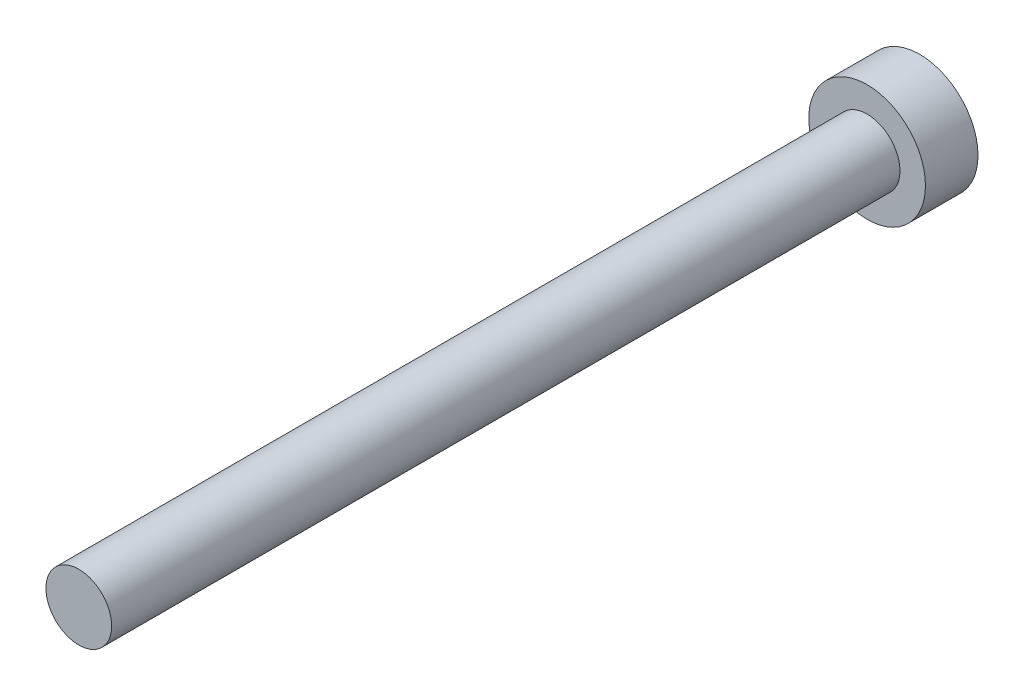
ISO-10303-21;
HEADER;
FILE_DESCRIPTION(('STEP AP214'),'2;1');
FILE_NAME('part.step','',(''),(''),'','','');
FILE_SCHEMA(('AUTOMOTIVE_DESIGN { 1 0 10303 214 1 1 1 1 }'));
ENDSEC;
DATA;
#1=APPLICATION_CONTEXT('core data for automotive mechanical design processes');
#2=APPLICATION_PROTOCOL_DEFINITION('international standard','automotive_design',2000,#1);
#3=PRODUCT_CONTEXT('',#1,'mechanical');
#4=PRODUCT('Part','Part','',(#3));
#5=PRODUCT_RELATED_PRODUCT_CATEGORY('part','',(#4));
#6=PRODUCT_DEFINITION_FORMATION('','',#4);
#7=PRODUCT_DEFINITION_CONTEXT('part definition',#1,'design');
#8=PRODUCT_DEFINITION('design','',#6,#7);
#9=PRODUCT_DEFINITION_SHAPE('','',#8);
#10=(LENGTH_UNIT() NAMED_UNIT(*) SI_UNIT(.MILLI.,.METRE.));
#11=(NAMED_UNIT(*) PLANE_ANGLE_UNIT() SI_UNIT($,.RADIAN.));
#12=(NAMED_UNIT(*) SI_UNIT($,.STERADIAN.) SOLID_ANGLE_UNIT());
#13=UNCERTAINTY_MEASURE_WITH_UNIT(LENGTH_MEASURE(1.E-05),#10,'distance_accuracy_value','');
#14=(GEOMETRIC_REPRESENTATION_CONTEXT(3) GLOBAL_UNCERTAINTY_ASSIGNED_CONTEXT((#13)) GLOBAL_UNIT_ASSIGNED_CONTEXT((#10,
#11,#12)) REPRESENTATION_CONTEXT('',''));
#15=CARTESIAN_POINT('',(0.,0.,0.));
#16=DIRECTION('',(0.,0.,1.));
#17=DIRECTION('',(1.,0.,0.));
#18=AXIS2_PLACEMENT_3D('',#15,#16,#17);
#19=CARTESIAN_POINT('',(0.,0.,30.));
#20=DIRECTION('',(0.,0.,-1.));
#21=DIRECTION('',(-1.,0.,0.));
#22=AXIS2_PLACEMENT_3D('',#19,#20,#21);
#23=CYLINDRICAL_SURFACE('',#22,1.25);
#24=CARTESIAN_POINT('',(0.,0.,30.));
#25=DIRECTION('',(0.,0.,1.));
#26=DIRECTION('',(1.,0.,0.));
#27=AXIS2_PLACEMENT_3D('',#24,#25,#26);
#28=CIRCLE('',#27,1.25);
#29=CARTESIAN_POINT('',(1.25,0.,30.));
#30=VERTEX_POINT('',#29);
#31=EDGE_CURVE('E10',#30,#30,#28,.T.);
#32=ORIENTED_EDGE('',*,*,#31,.F.);
#33=EDGE_LOOP('',(#32));
#34=FACE_BOUND('',#33,.T.);
#35=CARTESIAN_POINT('',(0.,0.,0.));
#36=DIRECTION('',(0.,0.,1.));
#37=DIRECTION('',(1.,0.,0.));
#38=AXIS2_PLACEMENT_3D('',#35,#36,#37);
#39=CIRCLE('',#38,1.25);
#40=CARTESIAN_POINT('',(1.25,0.,0.));
#41=VERTEX_POINT('',#40);
#42=EDGE_CURVE('E37',#41,#41,#39,.T.);
#43=ORIENTED_EDGE('',*,*,#42,.T.);
#44=EDGE_LOOP('',(#43));
#45=FACE_BOUND('',#44,.T.);
#46=ADVANCED_FACE('F34',(#34,#45),#23,.T.);
#47=CARTESIAN_POINT('',(0.,0.,30.));
#48=DIRECTION('',(0.,0.,1.));
#49=DIRECTION('',(1.,0.,0.));
#50=AXIS2_PLACEMENT_3D('',#47,#48,#49);
#51=PLANE('',#50);
#52=ORIENTED_EDGE('',*,*,#31,.T.);
#53=EDGE_LOOP('',(#52));
#54=FACE_BOUND('',#53,.T.);
#55=ADVANCED_FACE('F65',(#54),#51,.T.);
#56=CARTESIAN_POINT('',(0.,0.,-2.));
#57=DIRECTION('',(0.,0.,1.));
#58=DIRECTION('',(1.,0.,0.));
#59=AXIS2_PLACEMENT_3D('',#56,#57,#58);
#60=CYLINDRICAL_SURFACE('',#59,2.22);
#61=CARTESIAN_POINT('',(0.,0.,-2.));
#62=DIRECTION('',(0.,0.,1.));
#63=DIRECTION('',(1.,0.,0.));
#64=AXIS2_PLACEMENT_3D('',#61,#62,#63);
#65=CIRCLE('',#64,2.22);
#66=CARTESIAN_POINT('',(2.22,0.,-2.));
#67=VERTEX_POINT('',#66);
#68=EDGE_CURVE('E44',#67,#67,#65,.T.);
#69=ORIENTED_EDGE('',*,*,#68,.T.);
#70=EDGE_LOOP('',(#69));
#71=FACE_BOUND('',#70,.T.);
#72=CARTESIAN_POINT('',(0.,0.,0.));
#73=DIRECTION('',(0.,0.,1.));
#74=DIRECTION('',(1.,0.,0.));
#75=AXIS2_PLACEMENT_3D('',#72,#73,#74);
#76=CIRCLE('',#75,2.22);
#77=CARTESIAN_POINT('',(2.22,0.,0.));
#78=VERTEX_POINT('',#77);
#79=EDGE_CURVE('E46',#78,#78,#76,.T.);
#80=ORIENTED_EDGE('',*,*,#79,.F.);
#81=EDGE_LOOP('',(#80));
#82=FACE_BOUND('',#81,.T.);
#83=ADVANCED_FACE('F52',(#71,#82),#60,.T.);
#84=CARTESIAN_POINT('',(0.,0.,-2.));
#85=DIRECTION('',(0.,0.,1.));
#86=DIRECTION('',(1.,0.,0.));
#87=AXIS2_PLACEMENT_3D('',#84,#85,#86);
#88=PLANE('',#87);
#89=ORIENTED_EDGE('',*,*,#68,.F.);
#90=EDGE_LOOP('',(#89));
#91=FACE_BOUND('',#90,.T.);
#92=ADVANCED_FACE('F55',(#91),#88,.F.);
#93=CARTESIAN_POINT('',(0.,0.,0.));
#94=DIRECTION('',(0.,0.,1.));
#95=DIRECTION('',(1.,0.,0.));
#96=AXIS2_PLACEMENT_3D('',#93,#94,#95);
#97=PLANE('',#96);
#98=ORIENTED_EDGE('',*,*,#42,.F.);
#99=EDGE_LOOP('',(#98));
#100=FACE_BOUND('',#99,.T.);
#101=ORIENTED_EDGE('',*,*,#79,.T.);
#102=EDGE_LOOP('',(#101));
#103=FACE_BOUND('',#102,.T.);
#104=ADVANCED_FACE('F57',(#100,#103),#97,.T.);
#105=CLOSED_SHELL('',(#46,#55,#83,#92,#104));
#106=MANIFOLD_SOLID_BREP('B2',#105);
#107=ADVANCED_BREP_SHAPE_REPRESENTATION('',(#18,#106),#14);
#108=SHAPE_DEFINITION_REPRESENTATION(#9,#107);
ENDSEC;
END-ISO-10303-21;
